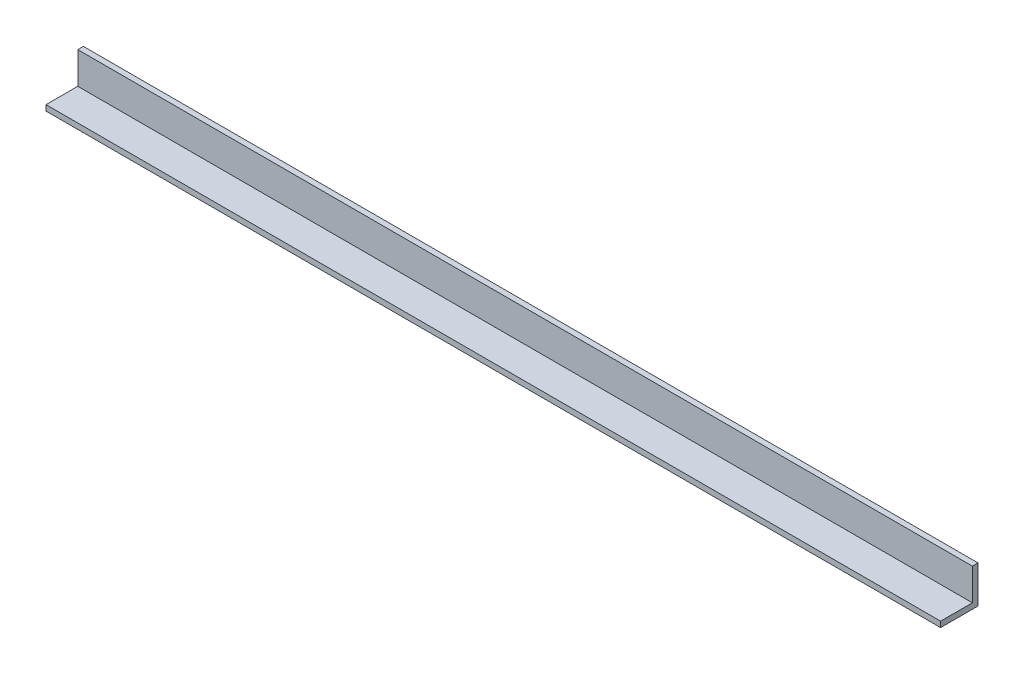
ISO-10303-21;
HEADER;
FILE_DESCRIPTION(('STEP AP214'),'2;1');
FILE_NAME('part.step','',(''),(''),'','','');
FILE_SCHEMA(('AUTOMOTIVE_DESIGN { 1 0 10303 214 1 1 1 1 }'));
ENDSEC;
DATA;
#1=APPLICATION_CONTEXT('core data for automotive mechanical design processes');
#2=APPLICATION_PROTOCOL_DEFINITION('international standard','automotive_design',2000,#1);
#3=PRODUCT_CONTEXT('',#1,'mechanical');
#4=PRODUCT('Part','Part','',(#3));
#5=PRODUCT_RELATED_PRODUCT_CATEGORY('part','',(#4));
#6=PRODUCT_DEFINITION_FORMATION('','',#4);
#7=PRODUCT_DEFINITION_CONTEXT('part definition',#1,'design');
#8=PRODUCT_DEFINITION('design','',#6,#7);
#9=PRODUCT_DEFINITION_SHAPE('','',#8);
#10=(LENGTH_UNIT() NAMED_UNIT(*) SI_UNIT(.MILLI.,.METRE.));
#11=(NAMED_UNIT(*) PLANE_ANGLE_UNIT() SI_UNIT($,.RADIAN.));
#12=(NAMED_UNIT(*) SI_UNIT($,.STERADIAN.) SOLID_ANGLE_UNIT());
#13=UNCERTAINTY_MEASURE_WITH_UNIT(LENGTH_MEASURE(1.E-05),#10,'distance_accuracy_value','');
#14=(GEOMETRIC_REPRESENTATION_CONTEXT(3) GLOBAL_UNCERTAINTY_ASSIGNED_CONTEXT((#13)) GLOBAL_UNIT_ASSIGNED_CONTEXT((#10,
#11,#12)) REPRESENTATION_CONTEXT('',''));
#15=CARTESIAN_POINT('',(0.,0.,0.));
#16=DIRECTION('',(0.,0.,1.));
#17=DIRECTION('',(1.,0.,0.));
#18=AXIS2_PLACEMENT_3D('',#15,#16,#17);
#19=CARTESIAN_POINT('',(0.,0.,80.));
#20=DIRECTION('',(1.,0.,0.));
#21=DIRECTION('',(0.,0.,-1.));
#22=AXIS2_PLACEMENT_3D('',#19,#20,#21);
#23=PLANE('',#22);
#24=DIRECTION('',(0.,0.,1.));
#25=VECTOR('',#24,1.);
#26=CARTESIAN_POINT('',(0.,12.,12.));
#27=LINE('',#26,#25);
#28=CARTESIAN_POINT('',(0.,12.,12.));
#29=VERTEX_POINT('',#28);
#30=CARTESIAN_POINT('',(0.,12.,80.));
#31=VERTEX_POINT('',#30);
#32=EDGE_CURVE('E46',#29,#31,#27,.T.);
#33=ORIENTED_EDGE('',*,*,#32,.F.);
#34=DIRECTION('',(0.,-1.,0.));
#35=VECTOR('',#34,1.);
#36=CARTESIAN_POINT('',(0.,80.,12.));
#37=LINE('',#36,#35);
#38=CARTESIAN_POINT('',(0.,80.,12.));
#39=VERTEX_POINT('',#38);
#40=EDGE_CURVE('E82',#39,#29,#37,.T.);
#41=ORIENTED_EDGE('',*,*,#40,.F.);
#42=DIRECTION('',(0.,0.,-1.));
#43=VECTOR('',#42,1.);
#44=CARTESIAN_POINT('',(0.,80.,80.));
#45=LINE('',#44,#43);
#46=CARTESIAN_POINT('',(0.,80.,0.));
#47=VERTEX_POINT('',#46);
#48=EDGE_CURVE('E75',#39,#47,#45,.T.);
#49=ORIENTED_EDGE('',*,*,#48,.T.);
#50=DIRECTION('',(0.,-1.,0.));
#51=VECTOR('',#50,1.);
#52=CARTESIAN_POINT('',(0.,0.,0.));
#53=LINE('',#52,#51);
#54=CARTESIAN_POINT('',(0.,0.,0.));
#55=VERTEX_POINT('',#54);
#56=EDGE_CURVE('E79',#47,#55,#53,.T.);
#57=ORIENTED_EDGE('',*,*,#56,.T.);
#58=DIRECTION('',(0.,0.,-1.));
#59=VECTOR('',#58,1.);
#60=CARTESIAN_POINT('',(0.,0.,80.));
#61=LINE('',#60,#59);
#62=CARTESIAN_POINT('',(0.,0.,80.));
#63=VERTEX_POINT('',#62);
#64=EDGE_CURVE('E11',#63,#55,#61,.T.);
#65=ORIENTED_EDGE('',*,*,#64,.F.);
#66=DIRECTION('',(0.,-1.,0.));
#67=VECTOR('',#66,1.);
#68=CARTESIAN_POINT('',(0.,0.,80.));
#69=LINE('',#68,#67);
#70=EDGE_CURVE('E95',#31,#63,#69,.T.);
#71=ORIENTED_EDGE('',*,*,#70,.F.);
#72=EDGE_LOOP('',(#33,#41,#49,#57,#65,#71));
#73=FACE_BOUND('',#72,.T.);
#74=ADVANCED_FACE('F32',(#73),#23,.F.);
#75=CARTESIAN_POINT('',(0.,0.,80.));
#76=DIRECTION('',(0.,1.,0.));
#77=DIRECTION('',(0.,0.,1.));
#78=AXIS2_PLACEMENT_3D('',#75,#76,#77);
#79=PLANE('',#78);
#80=DIRECTION('',(1.,0.,0.));
#81=VECTOR('',#80,1.);
#82=CARTESIAN_POINT('',(0.,0.,0.));
#83=LINE('',#82,#81);
#84=CARTESIAN_POINT('',(1915.,0.,0.));
#85=VERTEX_POINT('',#84);
#86=EDGE_CURVE('E99',#55,#85,#83,.T.);
#87=ORIENTED_EDGE('',*,*,#86,.T.);
#88=DIRECTION('',(0.,0.,-1.));
#89=VECTOR('',#88,1.);
#90=CARTESIAN_POINT('',(1915.,0.,80.));
#91=LINE('',#90,#89);
#92=CARTESIAN_POINT('',(1915.,0.,80.));
#93=VERTEX_POINT('',#92);
#94=EDGE_CURVE('E39',#93,#85,#91,.T.);
#95=ORIENTED_EDGE('',*,*,#94,.F.);
#96=DIRECTION('',(1.,0.,0.));
#97=VECTOR('',#96,1.);
#98=CARTESIAN_POINT('',(0.,0.,80.));
#99=LINE('',#98,#97);
#100=EDGE_CURVE('E55',#63,#93,#99,.T.);
#101=ORIENTED_EDGE('',*,*,#100,.F.);
#102=ORIENTED_EDGE('',*,*,#64,.T.);
#103=EDGE_LOOP('',(#87,#95,#101,#102));
#104=FACE_BOUND('',#103,.T.);
#105=ADVANCED_FACE('F116',(#104),#79,.F.);
#106=CARTESIAN_POINT('',(1915.,0.,80.));
#107=DIRECTION('',(-1.,0.,0.));
#108=DIRECTION('',(0.,0.,1.));
#109=AXIS2_PLACEMENT_3D('',#106,#107,#108);
#110=PLANE('',#109);
#111=DIRECTION('',(0.,0.,-1.));
#112=VECTOR('',#111,1.);
#113=CARTESIAN_POINT('',(1915.,80.,80.));
#114=LINE('',#113,#112);
#115=CARTESIAN_POINT('',(1915.,80.,12.));
#116=VERTEX_POINT('',#115);
#117=CARTESIAN_POINT('',(1915.,80.,0.));
#118=VERTEX_POINT('',#117);
#119=EDGE_CURVE('E85',#116,#118,#114,.T.);
#120=ORIENTED_EDGE('',*,*,#119,.F.);
#121=DIRECTION('',(0.,-1.,0.));
#122=VECTOR('',#121,1.);
#123=CARTESIAN_POINT('',(1915.,80.,12.));
#124=LINE('',#123,#122);
#125=CARTESIAN_POINT('',(1915.,12.,12.));
#126=VERTEX_POINT('',#125);
#127=EDGE_CURVE('E126',#116,#126,#124,.T.);
#128=ORIENTED_EDGE('',*,*,#127,.T.);
#129=DIRECTION('',(0.,0.,1.));
#130=VECTOR('',#129,1.);
#131=CARTESIAN_POINT('',(1915.,12.,12.));
#132=LINE('',#131,#130);
#133=CARTESIAN_POINT('',(1915.,12.,80.));
#134=VERTEX_POINT('',#133);
#135=EDGE_CURVE('E123',#126,#134,#132,.T.);
#136=ORIENTED_EDGE('',*,*,#135,.T.);
#137=DIRECTION('',(0.,1.,0.));
#138=VECTOR('',#137,1.);
#139=CARTESIAN_POINT('',(1915.,0.,80.));
#140=LINE('',#139,#138);
#141=EDGE_CURVE('E86',#93,#134,#140,.T.);
#142=ORIENTED_EDGE('',*,*,#141,.F.);
#143=ORIENTED_EDGE('',*,*,#94,.T.);
#144=DIRECTION('',(0.,1.,0.));
#145=VECTOR('',#144,1.);
#146=CARTESIAN_POINT('',(1915.,0.,0.));
#147=LINE('',#146,#145);
#148=EDGE_CURVE('E96',#85,#118,#147,.T.);
#149=ORIENTED_EDGE('',*,*,#148,.T.);
#150=EDGE_LOOP('',(#120,#128,#136,#142,#143,#149));
#151=FACE_BOUND('',#150,.T.);
#152=ADVANCED_FACE('F113',(#151),#110,.F.);
#153=CARTESIAN_POINT('',(0.,80.,80.));
#154=DIRECTION('',(0.,-1.,0.));
#155=DIRECTION('',(0.,0.,-1.));
#156=AXIS2_PLACEMENT_3D('',#153,#154,#155);
#157=PLANE('',#156);
#158=ORIENTED_EDGE('',*,*,#48,.F.);
#159=DIRECTION('',(-1.,0.,0.));
#160=VECTOR('',#159,1.);
#161=CARTESIAN_POINT('',(1915.,80.,12.));
#162=LINE('',#161,#160);
#163=EDGE_CURVE('E100',#116,#39,#162,.T.);
#164=ORIENTED_EDGE('',*,*,#163,.F.);
#165=ORIENTED_EDGE('',*,*,#119,.T.);
#166=DIRECTION('',(-1.,0.,0.));
#167=VECTOR('',#166,1.);
#168=CARTESIAN_POINT('',(0.,80.,0.));
#169=LINE('',#168,#167);
#170=EDGE_CURVE('E89',#118,#47,#169,.T.);
#171=ORIENTED_EDGE('',*,*,#170,.T.);
#172=EDGE_LOOP('',(#158,#164,#165,#171));
#173=FACE_BOUND('',#172,.T.);
#174=ADVANCED_FACE('F90',(#173),#157,.F.);
#175=CARTESIAN_POINT('',(0.,80.,80.));
#176=DIRECTION('',(0.,0.,-1.));
#177=DIRECTION('',(-1.,0.,0.));
#178=AXIS2_PLACEMENT_3D('',#175,#176,#177);
#179=PLANE('',#178);
#180=ORIENTED_EDGE('',*,*,#141,.T.);
#181=DIRECTION('',(-1.,0.,0.));
#182=VECTOR('',#181,1.);
#183=CARTESIAN_POINT('',(1915.,12.,80.));
#184=LINE('',#183,#182);
#185=EDGE_CURVE('E104',#134,#31,#184,.T.);
#186=ORIENTED_EDGE('',*,*,#185,.T.);
#187=ORIENTED_EDGE('',*,*,#70,.T.);
#188=ORIENTED_EDGE('',*,*,#100,.T.);
#189=EDGE_LOOP('',(#180,#186,#187,#188));
#190=FACE_BOUND('',#189,.T.);
#191=ADVANCED_FACE('F142',(#190),#179,.F.);
#192=CARTESIAN_POINT('',(0.,80.,0.));
#193=DIRECTION('',(0.,0.,-1.));
#194=DIRECTION('',(-1.,0.,0.));
#195=AXIS2_PLACEMENT_3D('',#192,#193,#194);
#196=PLANE('',#195);
#197=ORIENTED_EDGE('',*,*,#56,.F.);
#198=ORIENTED_EDGE('',*,*,#170,.F.);
#199=ORIENTED_EDGE('',*,*,#148,.F.);
#200=ORIENTED_EDGE('',*,*,#86,.F.);
#201=EDGE_LOOP('',(#197,#198,#199,#200));
#202=FACE_BOUND('',#201,.T.);
#203=ADVANCED_FACE('F98',(#202),#196,.T.);
#204=CARTESIAN_POINT('',(1915.,80.,12.));
#205=DIRECTION('',(0.,0.,-1.));
#206=DIRECTION('',(0.,1.,0.));
#207=AXIS2_PLACEMENT_3D('',#204,#205,#206);
#208=PLANE('',#207);
#209=ORIENTED_EDGE('',*,*,#40,.T.);
#210=DIRECTION('',(-1.,0.,0.));
#211=VECTOR('',#210,1.);
#212=CARTESIAN_POINT('',(1915.,12.,12.));
#213=LINE('',#212,#211);
#214=EDGE_CURVE('E121',#126,#29,#213,.T.);
#215=ORIENTED_EDGE('',*,*,#214,.F.);
#216=ORIENTED_EDGE('',*,*,#127,.F.);
#217=ORIENTED_EDGE('',*,*,#163,.T.);
#218=EDGE_LOOP('',(#209,#215,#216,#217));
#219=FACE_BOUND('',#218,.T.);
#220=ADVANCED_FACE('F137',(#219),#208,.F.);
#221=CARTESIAN_POINT('',(1915.,12.,12.));
#222=DIRECTION('',(0.,-1.,0.));
#223=DIRECTION('',(0.,0.,-1.));
#224=AXIS2_PLACEMENT_3D('',#221,#222,#223);
#225=PLANE('',#224);
#226=ORIENTED_EDGE('',*,*,#32,.T.);
#227=ORIENTED_EDGE('',*,*,#185,.F.);
#228=ORIENTED_EDGE('',*,*,#135,.F.);
#229=ORIENTED_EDGE('',*,*,#214,.T.);
#230=EDGE_LOOP('',(#226,#227,#228,#229));
#231=FACE_BOUND('',#230,.T.);
#232=ADVANCED_FACE('F141',(#231),#225,.F.);
#233=CLOSED_SHELL('',(#74,#105,#152,#174,#191,#203,#220,#232));
#234=MANIFOLD_SOLID_BREP('B2',#233);
#235=ADVANCED_BREP_SHAPE_REPRESENTATION('',(#18,#234),#14);
#236=SHAPE_DEFINITION_REPRESENTATION(#9,#235);
ENDSEC;
END-ISO-10303-21;
